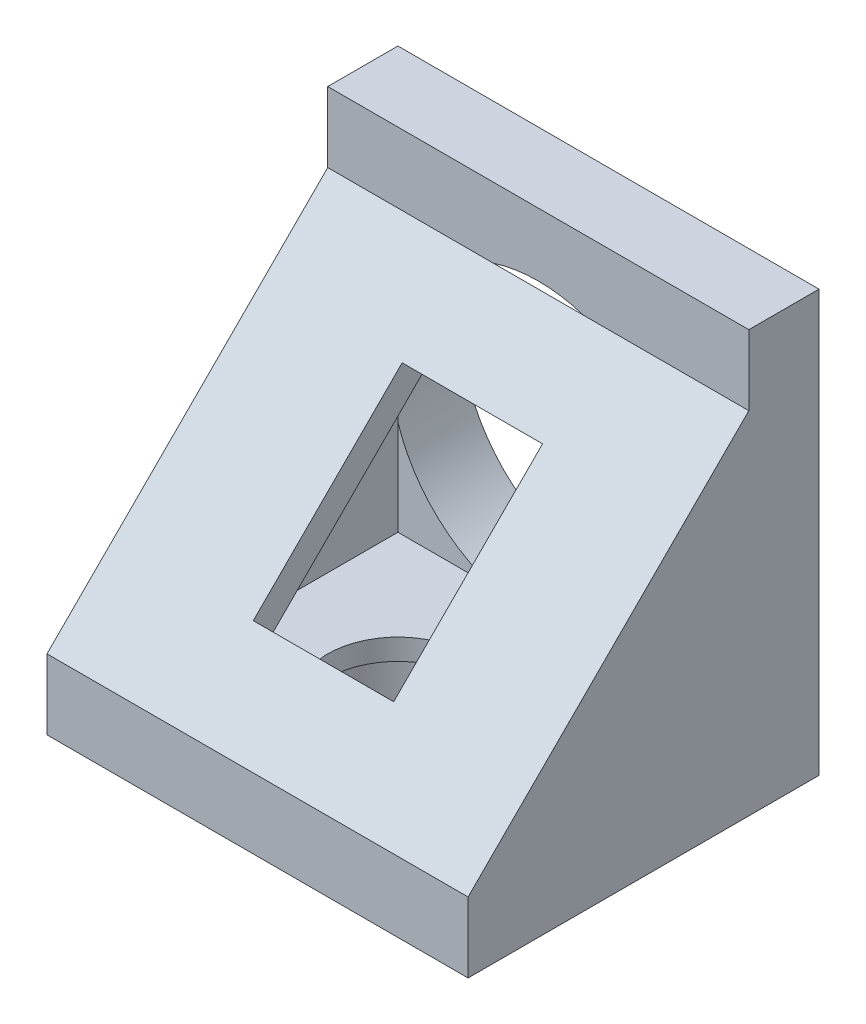
ISO-10303-21;
HEADER;
FILE_DESCRIPTION(('STEP AP214'),'2;1');
FILE_NAME('part.step','',(''),(''),'','','');
FILE_SCHEMA(('AUTOMOTIVE_DESIGN { 1 0 10303 214 1 1 1 1 }'));
ENDSEC;
DATA;
#1=APPLICATION_CONTEXT('core data for automotive mechanical design processes');
#2=APPLICATION_PROTOCOL_DEFINITION('international standard','automotive_design',2000,#1);
#3=PRODUCT_CONTEXT('',#1,'mechanical');
#4=PRODUCT('Part','Part','',(#3));
#5=PRODUCT_RELATED_PRODUCT_CATEGORY('part','',(#4));
#6=PRODUCT_DEFINITION_FORMATION('','',#4);
#7=PRODUCT_DEFINITION_CONTEXT('part definition',#1,'design');
#8=PRODUCT_DEFINITION('design','',#6,#7);
#9=PRODUCT_DEFINITION_SHAPE('','',#8);
#10=(LENGTH_UNIT() NAMED_UNIT(*) SI_UNIT(.MILLI.,.METRE.));
#11=(NAMED_UNIT(*) PLANE_ANGLE_UNIT() SI_UNIT($,.RADIAN.));
#12=(NAMED_UNIT(*) SI_UNIT($,.STERADIAN.) SOLID_ANGLE_UNIT());
#13=UNCERTAINTY_MEASURE_WITH_UNIT(LENGTH_MEASURE(1.E-05),#10,'distance_accuracy_value','');
#14=(GEOMETRIC_REPRESENTATION_CONTEXT(3) GLOBAL_UNCERTAINTY_ASSIGNED_CONTEXT((#13)) GLOBAL_UNIT_ASSIGNED_CONTEXT((#10,
#11,#12)) REPRESENTATION_CONTEXT('',''));
#15=CARTESIAN_POINT('',(0.,0.,0.));
#16=DIRECTION('',(0.,0.,1.));
#17=DIRECTION('',(1.,0.,0.));
#18=AXIS2_PLACEMENT_3D('',#15,#16,#17);
#19=CARTESIAN_POINT('',(0.,-10.,15.));
#20=DIRECTION('',(0.,-1.,0.));
#21=DIRECTION('',(0.,0.,-1.));
#22=AXIS2_PLACEMENT_3D('',#19,#20,#21);
#23=CYLINDRICAL_SURFACE('',#22,5.);
#24=CARTESIAN_POINT('',(0.,-10.,15.));
#25=DIRECTION('',(0.,-1.,0.));
#26=DIRECTION('',(0.,0.,-1.));
#27=AXIS2_PLACEMENT_3D('',#24,#25,#26);
#28=CIRCLE('',#27,5.);
#29=CARTESIAN_POINT('',(0.,-10.,10.));
#30=VERTEX_POINT('',#29);
#31=EDGE_CURVE('E330',#30,#30,#28,.T.);
#32=ORIENTED_EDGE('',*,*,#31,.F.);
#33=EDGE_LOOP('',(#32));
#34=FACE_BOUND('',#33,.T.);
#35=CARTESIAN_POINT('',(0.,-11.5,15.));
#36=DIRECTION('',(0.,-1.,0.));
#37=DIRECTION('',(0.,0.,-1.));
#38=AXIS2_PLACEMENT_3D('',#35,#36,#37);
#39=CIRCLE('',#38,5.);
#40=CARTESIAN_POINT('',(0.,-11.5,10.));
#41=VERTEX_POINT('',#40);
#42=EDGE_CURVE('E568',#41,#41,#39,.F.);
#43=ORIENTED_EDGE('',*,*,#42,.F.);
#44=EDGE_LOOP('',(#43));
#45=FACE_BOUND('',#44,.T.);
#46=ADVANCED_FACE('F39',(#34,#45),#23,.F.);
#47=CARTESIAN_POINT('',(0.,0.,5.));
#48=DIRECTION('',(0.,0.,-1.));
#49=DIRECTION('',(-1.,0.,0.));
#50=AXIS2_PLACEMENT_3D('',#47,#48,#49);
#51=PLANE('',#50);
#52=DIRECTION('',(0.,-1.,0.));
#53=VECTOR('',#52,1.);
#54=CARTESIAN_POINT('',(-10.,-10.,5.));
#55=LINE('',#54,#53);
#56=CARTESIAN_POINT('',(-10.,7.17157287525381,5.));
#57=VERTEX_POINT('',#56);
#58=CARTESIAN_POINT('',(-10.,3.20156211871643,5.));
#59=VERTEX_POINT('',#58);
#60=EDGE_CURVE('E181',#57,#59,#55,.T.);
#61=ORIENTED_EDGE('',*,*,#60,.T.);
#62=CARTESIAN_POINT('',(0.,0.,5.));
#63=DIRECTION('',(0.,0.,-1.));
#64=DIRECTION('',(-1.,0.,0.));
#65=AXIS2_PLACEMENT_3D('',#62,#63,#64);
#66=CIRCLE('',#65,10.5);
#67=CARTESIAN_POINT('',(-7.66932477438032,7.17157287525381,5.));
#68=VERTEX_POINT('',#67);
#69=EDGE_CURVE('E170',#59,#68,#66,.T.);
#70=ORIENTED_EDGE('',*,*,#69,.T.);
#71=DIRECTION('',(1.,0.,0.));
#72=VECTOR('',#71,1.);
#73=CARTESIAN_POINT('',(0.,7.17157287525381,5.));
#74=LINE('',#73,#72);
#75=EDGE_CURVE('E11',#57,#68,#74,.T.);
#76=ORIENTED_EDGE('',*,*,#75,.F.);
#77=EDGE_LOOP('',(#61,#70,#76));
#78=FACE_BOUND('',#77,.T.);
#79=ADVANCED_FACE('F187',(#78),#51,.F.);
#80=CARTESIAN_POINT('',(7.66932477438032,7.17157287525381,5.));
#81=VERTEX_POINT('',#80);
#82=CARTESIAN_POINT('',(10.,7.17157287525381,5.));
#83=VERTEX_POINT('',#82);
#84=EDGE_CURVE('E47',#81,#83,#74,.T.);
#85=ORIENTED_EDGE('',*,*,#84,.F.);
#86=CARTESIAN_POINT('',(10.,3.20156211871643,5.));
#87=VERTEX_POINT('',#86);
#88=EDGE_CURVE('E326',#81,#87,#66,.T.);
#89=ORIENTED_EDGE('',*,*,#88,.T.);
#90=DIRECTION('',(0.,1.,0.));
#91=VECTOR('',#90,1.);
#92=CARTESIAN_POINT('',(10.,-10.,5.));
#93=LINE('',#92,#91);
#94=EDGE_CURVE('E199',#87,#83,#93,.T.);
#95=ORIENTED_EDGE('',*,*,#94,.T.);
#96=EDGE_LOOP('',(#85,#89,#95));
#97=FACE_BOUND('',#96,.T.);
#98=ADVANCED_FACE('F374',(#97),#51,.F.);
#99=CARTESIAN_POINT('',(10.,-10.,5.));
#100=VERTEX_POINT('',#99);
#101=CARTESIAN_POINT('',(10.,-3.20156211871643,5.));
#102=VERTEX_POINT('',#101);
#103=EDGE_CURVE('E191',#100,#102,#93,.T.);
#104=ORIENTED_EDGE('',*,*,#103,.T.);
#105=CARTESIAN_POINT('',(3.20156211871643,-10.,5.));
#106=VERTEX_POINT('',#105);
#107=EDGE_CURVE('E629',#102,#106,#66,.T.);
#108=ORIENTED_EDGE('',*,*,#107,.T.);
#109=DIRECTION('',(1.,0.,0.));
#110=VECTOR('',#109,1.);
#111=CARTESIAN_POINT('',(-10.,-10.,5.));
#112=LINE('',#111,#110);
#113=EDGE_CURVE('E188',#106,#100,#112,.T.);
#114=ORIENTED_EDGE('',*,*,#113,.T.);
#115=EDGE_LOOP('',(#104,#108,#114));
#116=FACE_BOUND('',#115,.T.);
#117=ADVANCED_FACE('F430',(#116),#51,.F.);
#118=CARTESIAN_POINT('',(15.,15.,25.));
#119=DIRECTION('',(0.,-1.,0.));
#120=DIRECTION('',(0.,0.,-1.));
#121=AXIS2_PLACEMENT_3D('',#118,#119,#120);
#122=PLANE('',#121);
#123=DIRECTION('',(0.,0.,-1.));
#124=VECTOR('',#123,1.);
#125=CARTESIAN_POINT('',(-15.,15.,25.));
#126=LINE('',#125,#124);
#127=CARTESIAN_POINT('',(-15.,15.,5.));
#128=VERTEX_POINT('',#127);
#129=CARTESIAN_POINT('',(-15.,15.,0.));
#130=VERTEX_POINT('',#129);
#131=EDGE_CURVE('E230',#128,#130,#126,.T.);
#132=ORIENTED_EDGE('',*,*,#131,.F.);
#133=DIRECTION('',(1.,0.,0.));
#134=VECTOR('',#133,1.);
#135=CARTESIAN_POINT('',(-28.,15.,5.));
#136=LINE('',#135,#134);
#137=CARTESIAN_POINT('',(15.,15.,5.));
#138=VERTEX_POINT('',#137);
#139=EDGE_CURVE('E281',#128,#138,#136,.T.);
#140=ORIENTED_EDGE('',*,*,#139,.T.);
#141=DIRECTION('',(0.,0.,-1.));
#142=VECTOR('',#141,1.);
#143=CARTESIAN_POINT('',(15.,15.,25.));
#144=LINE('',#143,#142);
#145=CARTESIAN_POINT('',(15.,15.,0.));
#146=VERTEX_POINT('',#145);
#147=EDGE_CURVE('E215',#138,#146,#144,.T.);
#148=ORIENTED_EDGE('',*,*,#147,.T.);
#149=DIRECTION('',(-1.,0.,0.));
#150=VECTOR('',#149,1.);
#151=CARTESIAN_POINT('',(15.,15.,0.));
#152=LINE('',#151,#150);
#153=EDGE_CURVE('E204',#146,#130,#152,.T.);
#154=ORIENTED_EDGE('',*,*,#153,.T.);
#155=EDGE_LOOP('',(#132,#140,#148,#154));
#156=FACE_BOUND('',#155,.T.);
#157=ADVANCED_FACE('F41',(#156),#122,.F.);
#158=CARTESIAN_POINT('',(-15.,-15.,25.));
#159=DIRECTION('',(1.,0.,0.));
#160=DIRECTION('',(0.,0.,-1.));
#161=AXIS2_PLACEMENT_3D('',#158,#159,#160);
#162=PLANE('',#161);
#163=DIRECTION('',(0.,0.707106781186548,-0.707106781186548));
#164=VECTOR('',#163,1.);
#165=CARTESIAN_POINT('',(-15.,-12.5,27.5));
#166=LINE('',#165,#164);
#167=CARTESIAN_POINT('',(-15.,-10.,25.));
#168=VERTEX_POINT('',#167);
#169=CARTESIAN_POINT('',(-15.,10.,5.));
#170=VERTEX_POINT('',#169);
#171=EDGE_CURVE('E284',#168,#170,#166,.T.);
#172=ORIENTED_EDGE('',*,*,#171,.T.);
#173=DIRECTION('',(0.,1.,0.));
#174=VECTOR('',#173,1.);
#175=CARTESIAN_POINT('',(-15.,-15.,5.));
#176=LINE('',#175,#174);
#177=EDGE_CURVE('E200',#170,#128,#176,.T.);
#178=ORIENTED_EDGE('',*,*,#177,.T.);
#179=ORIENTED_EDGE('',*,*,#131,.T.);
#180=DIRECTION('',(0.,-1.,0.));
#181=VECTOR('',#180,1.);
#182=CARTESIAN_POINT('',(-15.,-15.,0.));
#183=LINE('',#182,#181);
#184=CARTESIAN_POINT('',(-15.,-15.,0.));
#185=VERTEX_POINT('',#184);
#186=EDGE_CURVE('E218',#130,#185,#183,.T.);
#187=ORIENTED_EDGE('',*,*,#186,.T.);
#188=DIRECTION('',(0.,0.,-1.));
#189=VECTOR('',#188,1.);
#190=CARTESIAN_POINT('',(-15.,-15.,25.));
#191=LINE('',#190,#189);
#192=CARTESIAN_POINT('',(-15.,-15.,25.));
#193=VERTEX_POINT('',#192);
#194=EDGE_CURVE('E228',#193,#185,#191,.T.);
#195=ORIENTED_EDGE('',*,*,#194,.F.);
#196=DIRECTION('',(0.,-1.,0.));
#197=VECTOR('',#196,1.);
#198=CARTESIAN_POINT('',(-15.,-15.,25.));
#199=LINE('',#198,#197);
#200=EDGE_CURVE('E207',#168,#193,#199,.T.);
#201=ORIENTED_EDGE('',*,*,#200,.F.);
#202=EDGE_LOOP('',(#172,#178,#179,#187,#195,#201));
#203=FACE_BOUND('',#202,.T.);
#204=ADVANCED_FACE('F290',(#203),#162,.F.);
#205=CARTESIAN_POINT('',(15.,-15.,25.));
#206=DIRECTION('',(0.,1.,0.));
#207=DIRECTION('',(0.,0.,1.));
#208=AXIS2_PLACEMENT_3D('',#205,#206,#207);
#209=PLANE('',#208);
#210=CARTESIAN_POINT('',(0.,-15.,15.));
#211=DIRECTION('',(0.,-1.,0.));
#212=DIRECTION('',(0.,0.,-1.));
#213=AXIS2_PLACEMENT_3D('',#210,#211,#212);
#214=CIRCLE('',#213,6.5);
#215=CARTESIAN_POINT('',(0.,-15.,8.5));
#216=VERTEX_POINT('',#215);
#217=EDGE_CURVE('E574',#216,#216,#214,.T.);
#218=ORIENTED_EDGE('',*,*,#217,.F.);
#219=EDGE_LOOP('',(#218));
#220=FACE_BOUND('',#219,.T.);
#221=DIRECTION('',(1.,0.,0.));
#222=VECTOR('',#221,1.);
#223=CARTESIAN_POINT('',(15.,-15.,0.));
#224=LINE('',#223,#222);
#225=CARTESIAN_POINT('',(15.,-15.,0.));
#226=VERTEX_POINT('',#225);
#227=EDGE_CURVE('E220',#185,#226,#224,.T.);
#228=ORIENTED_EDGE('',*,*,#227,.T.);
#229=DIRECTION('',(0.,0.,-1.));
#230=VECTOR('',#229,1.);
#231=CARTESIAN_POINT('',(15.,-15.,25.));
#232=LINE('',#231,#230);
#233=CARTESIAN_POINT('',(15.,-15.,25.));
#234=VERTEX_POINT('',#233);
#235=EDGE_CURVE('E225',#234,#226,#232,.T.);
#236=ORIENTED_EDGE('',*,*,#235,.F.);
#237=DIRECTION('',(1.,0.,0.));
#238=VECTOR('',#237,1.);
#239=CARTESIAN_POINT('',(15.,-15.,25.));
#240=LINE('',#239,#238);
#241=EDGE_CURVE('E209',#193,#234,#240,.T.);
#242=ORIENTED_EDGE('',*,*,#241,.F.);
#243=ORIENTED_EDGE('',*,*,#194,.T.);
#244=EDGE_LOOP('',(#228,#236,#242,#243));
#245=FACE_BOUND('',#244,.T.);
#246=ADVANCED_FACE('F305',(#220,#245),#209,.F.);
#247=CARTESIAN_POINT('',(15.,-15.,25.));
#248=DIRECTION('',(-1.,0.,0.));
#249=DIRECTION('',(0.,0.,1.));
#250=AXIS2_PLACEMENT_3D('',#247,#248,#249);
#251=PLANE('',#250);
#252=DIRECTION('',(0.,0.707106781186548,-0.707106781186548));
#253=VECTOR('',#252,1.);
#254=CARTESIAN_POINT('',(15.,7.5,7.5));
#255=LINE('',#254,#253);
#256=CARTESIAN_POINT('',(15.,-10.,25.));
#257=VERTEX_POINT('',#256);
#258=CARTESIAN_POINT('',(15.,10.,5.));
#259=VERTEX_POINT('',#258);
#260=EDGE_CURVE('E275',#257,#259,#255,.T.);
#261=ORIENTED_EDGE('',*,*,#260,.F.);
#262=DIRECTION('',(0.,1.,0.));
#263=VECTOR('',#262,1.);
#264=CARTESIAN_POINT('',(15.,-15.,25.));
#265=LINE('',#264,#263);
#266=EDGE_CURVE('E212',#234,#257,#265,.T.);
#267=ORIENTED_EDGE('',*,*,#266,.F.);
#268=ORIENTED_EDGE('',*,*,#235,.T.);
#269=DIRECTION('',(0.,1.,0.));
#270=VECTOR('',#269,1.);
#271=CARTESIAN_POINT('',(15.,-15.,0.));
#272=LINE('',#271,#270);
#273=EDGE_CURVE('E210',#226,#146,#272,.T.);
#274=ORIENTED_EDGE('',*,*,#273,.T.);
#275=ORIENTED_EDGE('',*,*,#147,.F.);
#276=DIRECTION('',(0.,1.,0.));
#277=VECTOR('',#276,1.);
#278=CARTESIAN_POINT('',(15.,0.,5.));
#279=LINE('',#278,#277);
#280=EDGE_CURVE('E278',#259,#138,#279,.T.);
#281=ORIENTED_EDGE('',*,*,#280,.F.);
#282=EDGE_LOOP('',(#261,#267,#268,#274,#275,#281));
#283=FACE_BOUND('',#282,.T.);
#284=ADVANCED_FACE('F580',(#283),#251,.F.);
#285=CARTESIAN_POINT('',(0.,0.,25.));
#286=DIRECTION('',(0.,0.,-1.));
#287=DIRECTION('',(-1.,0.,0.));
#288=AXIS2_PLACEMENT_3D('',#285,#286,#287);
#289=PLANE('',#288);
#290=ORIENTED_EDGE('',*,*,#266,.T.);
#291=DIRECTION('',(1.,0.,0.));
#292=VECTOR('',#291,1.);
#293=CARTESIAN_POINT('',(-10.,-10.,25.));
#294=LINE('',#293,#292);
#295=EDGE_CURVE('E197',#168,#257,#294,.T.);
#296=ORIENTED_EDGE('',*,*,#295,.F.);
#297=ORIENTED_EDGE('',*,*,#200,.T.);
#298=ORIENTED_EDGE('',*,*,#241,.T.);
#299=EDGE_LOOP('',(#290,#296,#297,#298));
#300=FACE_BOUND('',#299,.T.);
#301=ADVANCED_FACE('F309',(#300),#289,.F.);
#302=CARTESIAN_POINT('',(0.,0.,0.));
#303=DIRECTION('',(0.,0.,-1.));
#304=DIRECTION('',(-1.,0.,0.));
#305=AXIS2_PLACEMENT_3D('',#302,#303,#304);
#306=PLANE('',#305);
#307=CARTESIAN_POINT('',(0.,0.,0.));
#308=DIRECTION('',(0.,0.,-1.));
#309=DIRECTION('',(-1.,0.,0.));
#310=AXIS2_PLACEMENT_3D('',#307,#308,#309);
#311=CIRCLE('',#310,10.5);
#312=CARTESIAN_POINT('',(-10.5,0.,0.));
#313=VERTEX_POINT('',#312);
#314=EDGE_CURVE('E168',#313,#313,#311,.T.);
#315=ORIENTED_EDGE('',*,*,#314,.F.);
#316=EDGE_LOOP('',(#315));
#317=FACE_BOUND('',#316,.T.);
#318=ORIENTED_EDGE('',*,*,#153,.F.);
#319=ORIENTED_EDGE('',*,*,#273,.F.);
#320=ORIENTED_EDGE('',*,*,#227,.F.);
#321=ORIENTED_EDGE('',*,*,#186,.F.);
#322=EDGE_LOOP('',(#318,#319,#320,#321));
#323=FACE_BOUND('',#322,.T.);
#324=ADVANCED_FACE('F300',(#317,#323),#306,.T.);
#325=DIRECTION('',(1.,0.,0.));
#326=VECTOR('',#325,1.);
#327=CARTESIAN_POINT('',(-28.,10.,5.));
#328=LINE('',#327,#326);
#329=CARTESIAN_POINT('',(-3.20156211871644,10.,5.));
#330=VERTEX_POINT('',#329);
#331=EDGE_CURVE('E285',#170,#330,#328,.T.);
#332=ORIENTED_EDGE('',*,*,#331,.T.);
#333=CARTESIAN_POINT('',(3.20156211871644,9.99999999999999,5.));
#334=VERTEX_POINT('',#333);
#335=EDGE_CURVE('E318',#330,#334,#66,.T.);
#336=ORIENTED_EDGE('',*,*,#335,.T.);
#337=EDGE_CURVE('E280',#334,#259,#328,.T.);
#338=ORIENTED_EDGE('',*,*,#337,.T.);
#339=ORIENTED_EDGE('',*,*,#280,.T.);
#340=ORIENTED_EDGE('',*,*,#139,.F.);
#341=ORIENTED_EDGE('',*,*,#177,.F.);
#342=EDGE_LOOP('',(#332,#336,#338,#339,#340,#341));
#343=FACE_BOUND('',#342,.T.);
#344=ADVANCED_FACE('F317',(#343),#51,.F.);
#345=CARTESIAN_POINT('',(-28.,7.5,7.5));
#346=DIRECTION('',(0.,-0.707106781186548,-0.707106781186548));
#347=DIRECTION('',(0.,0.707106781186548,-0.707106781186548));
#348=AXIS2_PLACEMENT_3D('',#345,#346,#347);
#349=PLANE('',#348);
#350=ORIENTED_EDGE('',*,*,#171,.F.);
#351=ORIENTED_EDGE('',*,*,#295,.T.);
#352=ORIENTED_EDGE('',*,*,#260,.T.);
#353=ORIENTED_EDGE('',*,*,#337,.F.);
#354=EDGE_CURVE('E288',#330,#334,#328,.T.);
#355=ORIENTED_EDGE('',*,*,#354,.F.);
#356=ORIENTED_EDGE('',*,*,#331,.F.);
#357=EDGE_LOOP('',(#350,#351,#352,#353,#355,#356));
#358=FACE_BOUND('',#357,.T.);
#359=DIRECTION('',(0.,-0.707106781186547,0.707106781186547));
#360=VECTOR('',#359,1.);
#361=CARTESIAN_POINT('',(-5.,5.3033008588991,9.6966991411009));
#362=LINE('',#361,#360);
#363=CARTESIAN_POINT('',(-5.,5.3033008588991,9.6966991411009));
#364=VERTEX_POINT('',#363);
#365=CARTESIAN_POINT('',(-5.,-5.3033008588991,20.3033008588991));
#366=VERTEX_POINT('',#365);
#367=EDGE_CURVE('E241',#364,#366,#362,.T.);
#368=ORIENTED_EDGE('',*,*,#367,.F.);
#369=DIRECTION('',(-1.,0.,0.));
#370=VECTOR('',#369,1.);
#371=CARTESIAN_POINT('',(5.,5.3033008588991,9.6966991411009));
#372=LINE('',#371,#370);
#373=CARTESIAN_POINT('',(5.,5.3033008588991,9.6966991411009));
#374=VERTEX_POINT('',#373);
#375=EDGE_CURVE('E256',#374,#364,#372,.T.);
#376=ORIENTED_EDGE('',*,*,#375,.F.);
#377=DIRECTION('',(0.,0.707106781186547,-0.707106781186547));
#378=VECTOR('',#377,1.);
#379=CARTESIAN_POINT('',(5.,5.3033008588991,9.6966991411009));
#380=LINE('',#379,#378);
#381=CARTESIAN_POINT('',(5.,-5.3033008588991,20.3033008588991));
#382=VERTEX_POINT('',#381);
#383=EDGE_CURVE('E248',#382,#374,#380,.T.);
#384=ORIENTED_EDGE('',*,*,#383,.F.);
#385=DIRECTION('',(1.,0.,0.));
#386=VECTOR('',#385,1.);
#387=CARTESIAN_POINT('',(5.,-5.3033008588991,20.3033008588991));
#388=LINE('',#387,#386);
#389=EDGE_CURVE('E242',#366,#382,#388,.T.);
#390=ORIENTED_EDGE('',*,*,#389,.F.);
#391=EDGE_LOOP('',(#368,#376,#384,#390));
#392=FACE_BOUND('',#391,.T.);
#393=ADVANCED_FACE('F312',(#358,#392),#349,.F.);
#394=CARTESIAN_POINT('',(0.,6.08578643762691,6.0857864376269));
#395=DIRECTION('',(0.,0.707106781186548,0.707106781186547));
#396=DIRECTION('',(0.,-0.707106781186547,0.707106781186548));
#397=AXIS2_PLACEMENT_3D('',#394,#395,#396);
#398=PLANE('',#397);
#399=DIRECTION('',(-1.,0.,0.));
#400=VECTOR('',#399,1.);
#401=CARTESIAN_POINT('',(5.,3.88908729652601,8.2824855787278));
#402=LINE('',#401,#400);
#403=CARTESIAN_POINT('',(5.,3.88908729652601,8.2824855787278));
#404=VERTEX_POINT('',#403);
#405=CARTESIAN_POINT('',(-5.,3.88908729652601,8.2824855787278));
#406=VERTEX_POINT('',#405);
#407=EDGE_CURVE('E251',#404,#406,#402,.T.);
#408=ORIENTED_EDGE('',*,*,#407,.T.);
#409=DIRECTION('',(0.,-0.707106781186547,0.707106781186547));
#410=VECTOR('',#409,1.);
#411=CARTESIAN_POINT('',(-5.,3.88908729652601,8.2824855787278));
#412=LINE('',#411,#410);
#413=CARTESIAN_POINT('',(-5.,-6.7175144212722,18.889087296526));
#414=VERTEX_POINT('',#413);
#415=EDGE_CURVE('E259',#406,#414,#412,.T.);
#416=ORIENTED_EDGE('',*,*,#415,.T.);
#417=DIRECTION('',(1.,0.,0.));
#418=VECTOR('',#417,1.);
#419=CARTESIAN_POINT('',(5.,-6.7175144212722,18.889087296526));
#420=LINE('',#419,#418);
#421=CARTESIAN_POINT('',(5.,-6.7175144212722,18.889087296526));
#422=VERTEX_POINT('',#421);
#423=EDGE_CURVE('E336',#414,#422,#420,.T.);
#424=ORIENTED_EDGE('',*,*,#423,.T.);
#425=DIRECTION('',(0.,0.707106781186547,-0.707106781186547));
#426=VECTOR('',#425,1.);
#427=CARTESIAN_POINT('',(5.,3.88908729652601,8.2824855787278));
#428=LINE('',#427,#426);
#429=EDGE_CURVE('E338',#422,#404,#428,.T.);
#430=ORIENTED_EDGE('',*,*,#429,.T.);
#431=EDGE_LOOP('',(#408,#416,#424,#430));
#432=FACE_BOUND('',#431,.T.);
#433=ORIENTED_EDGE('',*,*,#75,.T.);
#434=EDGE_CURVE('E48',#68,#81,#74,.T.);
#435=ORIENTED_EDGE('',*,*,#434,.T.);
#436=ORIENTED_EDGE('',*,*,#84,.T.);
#437=DIRECTION('',(0.,-0.707106781186547,0.707106781186548));
#438=VECTOR('',#437,1.);
#439=CARTESIAN_POINT('',(10.,-1.41421356237309,13.5857864376269));
#440=LINE('',#439,#438);
#441=CARTESIAN_POINT('',(10.,-10.,22.1715728752538));
#442=VERTEX_POINT('',#441);
#443=EDGE_CURVE('E273',#83,#442,#440,.T.);
#444=ORIENTED_EDGE('',*,*,#443,.T.);
#445=DIRECTION('',(-1.,0.,0.));
#446=VECTOR('',#445,1.);
#447=CARTESIAN_POINT('',(-10.,-10.,22.1715728752538));
#448=LINE('',#447,#446);
#449=CARTESIAN_POINT('',(-10.,-10.,22.1715728752538));
#450=VERTEX_POINT('',#449);
#451=EDGE_CURVE('E270',#442,#450,#448,.T.);
#452=ORIENTED_EDGE('',*,*,#451,.T.);
#453=DIRECTION('',(0.,0.707106781186547,-0.707106781186548));
#454=VECTOR('',#453,1.);
#455=CARTESIAN_POINT('',(-10.,-1.41421356237309,13.5857864376269));
#456=LINE('',#455,#454);
#457=EDGE_CURVE('E262',#450,#57,#456,.T.);
#458=ORIENTED_EDGE('',*,*,#457,.T.);
#459=EDGE_LOOP('',(#433,#435,#436,#444,#452,#458));
#460=FACE_BOUND('',#459,.T.);
#461=ADVANCED_FACE('F343',(#432,#460),#398,.F.);
#462=CARTESIAN_POINT('',(-5.,3.88908729652601,8.2824855787278));
#463=DIRECTION('',(-1.,0.,0.));
#464=DIRECTION('',(0.,0.,1.));
#465=AXIS2_PLACEMENT_3D('',#462,#463,#464);
#466=PLANE('',#465);
#467=ORIENTED_EDGE('',*,*,#367,.T.);
#468=DIRECTION('',(0.,0.707106781186548,0.707106781186547));
#469=VECTOR('',#468,1.);
#470=CARTESIAN_POINT('',(-5.,-6.7175144212722,18.889087296526));
#471=LINE('',#470,#469);
#472=EDGE_CURVE('E267',#414,#366,#471,.T.);
#473=ORIENTED_EDGE('',*,*,#472,.F.);
#474=ORIENTED_EDGE('',*,*,#415,.F.);
#475=DIRECTION('',(0.,0.707106781186548,0.707106781186547));
#476=VECTOR('',#475,1.);
#477=CARTESIAN_POINT('',(-5.,3.88908729652601,8.2824855787278));
#478=LINE('',#477,#476);
#479=EDGE_CURVE('E260',#406,#364,#478,.T.);
#480=ORIENTED_EDGE('',*,*,#479,.T.);
#481=EDGE_LOOP('',(#467,#473,#474,#480));
#482=FACE_BOUND('',#481,.T.);
#483=ADVANCED_FACE('F348',(#482),#466,.F.);
#484=CARTESIAN_POINT('',(5.,3.88908729652601,8.2824855787278));
#485=DIRECTION('',(0.,0.707106781186547,-0.707106781186548));
#486=DIRECTION('',(0.,0.707106781186548,0.707106781186547));
#487=AXIS2_PLACEMENT_3D('',#484,#485,#486);
#488=PLANE('',#487);
#489=ORIENTED_EDGE('',*,*,#375,.T.);
#490=ORIENTED_EDGE('',*,*,#479,.F.);
#491=ORIENTED_EDGE('',*,*,#407,.F.);
#492=DIRECTION('',(0.,0.707106781186548,0.707106781186547));
#493=VECTOR('',#492,1.);
#494=CARTESIAN_POINT('',(5.,3.88908729652601,8.2824855787278));
#495=LINE('',#494,#493);
#496=EDGE_CURVE('E263',#404,#374,#495,.T.);
#497=ORIENTED_EDGE('',*,*,#496,.T.);
#498=EDGE_LOOP('',(#489,#490,#491,#497));
#499=FACE_BOUND('',#498,.T.);
#500=ADVANCED_FACE('F346',(#499),#488,.F.);
#501=CARTESIAN_POINT('',(5.,3.88908729652601,8.2824855787278));
#502=DIRECTION('',(1.,0.,0.));
#503=DIRECTION('',(0.,0.,-1.));
#504=AXIS2_PLACEMENT_3D('',#501,#502,#503);
#505=PLANE('',#504);
#506=ORIENTED_EDGE('',*,*,#383,.T.);
#507=ORIENTED_EDGE('',*,*,#496,.F.);
#508=ORIENTED_EDGE('',*,*,#429,.F.);
#509=DIRECTION('',(0.,0.707106781186548,0.707106781186547));
#510=VECTOR('',#509,1.);
#511=CARTESIAN_POINT('',(5.,-6.7175144212722,18.889087296526));
#512=LINE('',#511,#510);
#513=EDGE_CURVE('E265',#422,#382,#512,.T.);
#514=ORIENTED_EDGE('',*,*,#513,.T.);
#515=EDGE_LOOP('',(#506,#507,#508,#514));
#516=FACE_BOUND('',#515,.T.);
#517=ADVANCED_FACE('F356',(#516),#505,.F.);
#518=CARTESIAN_POINT('',(5.,-6.7175144212722,18.889087296526));
#519=DIRECTION('',(0.,-0.707106781186547,0.707106781186548));
#520=DIRECTION('',(0.,-0.707106781186548,-0.707106781186547));
#521=AXIS2_PLACEMENT_3D('',#518,#519,#520);
#522=PLANE('',#521);
#523=ORIENTED_EDGE('',*,*,#389,.T.);
#524=ORIENTED_EDGE('',*,*,#513,.F.);
#525=ORIENTED_EDGE('',*,*,#423,.F.);
#526=ORIENTED_EDGE('',*,*,#472,.T.);
#527=EDGE_LOOP('',(#523,#524,#525,#526));
#528=FACE_BOUND('',#527,.T.);
#529=ADVANCED_FACE('F353',(#528),#522,.F.);
#530=CARTESIAN_POINT('',(-10.,-10.,5.));
#531=VERTEX_POINT('',#530);
#532=CARTESIAN_POINT('',(-3.20156211871643,-10.,5.));
#533=VERTEX_POINT('',#532);
#534=EDGE_CURVE('E189',#531,#533,#112,.T.);
#535=ORIENTED_EDGE('',*,*,#534,.T.);
#536=CARTESIAN_POINT('',(-10.,-3.20156211871643,5.));
#537=VERTEX_POINT('',#536);
#538=EDGE_CURVE('E167',#533,#537,#66,.T.);
#539=ORIENTED_EDGE('',*,*,#538,.T.);
#540=EDGE_CURVE('E184',#537,#531,#55,.T.);
#541=ORIENTED_EDGE('',*,*,#540,.T.);
#542=EDGE_LOOP('',(#535,#539,#541));
#543=FACE_BOUND('',#542,.T.);
#544=ADVANCED_FACE('F365',(#543),#51,.F.);
#545=CARTESIAN_POINT('',(-10.,-10.,5.));
#546=DIRECTION('',(-1.,0.,0.));
#547=DIRECTION('',(0.,0.,1.));
#548=AXIS2_PLACEMENT_3D('',#545,#546,#547);
#549=PLANE('',#548);
#550=ORIENTED_EDGE('',*,*,#457,.F.);
#551=DIRECTION('',(0.,0.,1.));
#552=VECTOR('',#551,1.);
#553=CARTESIAN_POINT('',(-10.,-10.,5.));
#554=LINE('',#553,#552);
#555=EDGE_CURVE('E196',#531,#450,#554,.T.);
#556=ORIENTED_EDGE('',*,*,#555,.F.);
#557=ORIENTED_EDGE('',*,*,#540,.F.);
#558=EDGE_CURVE('E165',#59,#537,#55,.T.);
#559=ORIENTED_EDGE('',*,*,#558,.F.);
#560=ORIENTED_EDGE('',*,*,#60,.F.);
#561=EDGE_LOOP('',(#550,#556,#557,#559,#560));
#562=FACE_BOUND('',#561,.T.);
#563=ADVANCED_FACE('F180',(#562),#549,.F.);
#564=CARTESIAN_POINT('',(-10.,-10.,5.));
#565=DIRECTION('',(0.,-1.,0.));
#566=DIRECTION('',(0.,0.,-1.));
#567=AXIS2_PLACEMENT_3D('',#564,#565,#566);
#568=PLANE('',#567);
#569=ORIENTED_EDGE('',*,*,#31,.T.);
#570=EDGE_LOOP('',(#569));
#571=FACE_BOUND('',#570,.T.);
#572=ORIENTED_EDGE('',*,*,#451,.F.);
#573=DIRECTION('',(0.,0.,1.));
#574=VECTOR('',#573,1.);
#575=CARTESIAN_POINT('',(10.,-10.,5.));
#576=LINE('',#575,#574);
#577=EDGE_CURVE('E201',#100,#442,#576,.T.);
#578=ORIENTED_EDGE('',*,*,#577,.F.);
#579=ORIENTED_EDGE('',*,*,#113,.F.);
#580=EDGE_CURVE('E185',#533,#106,#112,.T.);
#581=ORIENTED_EDGE('',*,*,#580,.F.);
#582=ORIENTED_EDGE('',*,*,#534,.F.);
#583=ORIENTED_EDGE('',*,*,#555,.T.);
#584=EDGE_LOOP('',(#572,#578,#579,#581,#582,#583));
#585=FACE_BOUND('',#584,.T.);
#586=ADVANCED_FACE('F483',(#571,#585),#568,.F.);
#587=CARTESIAN_POINT('',(10.,-10.,5.));
#588=DIRECTION('',(1.,0.,0.));
#589=DIRECTION('',(0.,0.,-1.));
#590=AXIS2_PLACEMENT_3D('',#587,#588,#589);
#591=PLANE('',#590);
#592=ORIENTED_EDGE('',*,*,#443,.F.);
#593=ORIENTED_EDGE('',*,*,#94,.F.);
#594=EDGE_CURVE('E176',#102,#87,#93,.T.);
#595=ORIENTED_EDGE('',*,*,#594,.F.);
#596=ORIENTED_EDGE('',*,*,#103,.F.);
#597=ORIENTED_EDGE('',*,*,#577,.T.);
#598=EDGE_LOOP('',(#592,#593,#595,#596,#597));
#599=FACE_BOUND('',#598,.T.);
#600=ADVANCED_FACE('F384',(#599),#591,.F.);
#601=CARTESIAN_POINT('',(0.,0.,5.));
#602=DIRECTION('',(0.,0.,-1.));
#603=DIRECTION('',(-1.,0.,0.));
#604=AXIS2_PLACEMENT_3D('',#601,#602,#603);
#605=PLANE('',#604);
#606=ORIENTED_EDGE('',*,*,#558,.T.);
#607=EDGE_CURVE('E55',#537,#59,#66,.T.);
#608=ORIENTED_EDGE('',*,*,#607,.T.);
#609=EDGE_LOOP('',(#606,#608));
#610=FACE_BOUND('',#609,.T.);
#611=ADVANCED_FACE('F163',(#610),#605,.T.);
#612=ORIENTED_EDGE('',*,*,#580,.T.);
#613=EDGE_CURVE('E628',#106,#533,#66,.T.);
#614=ORIENTED_EDGE('',*,*,#613,.T.);
#615=EDGE_LOOP('',(#612,#614));
#616=FACE_BOUND('',#615,.T.);
#617=ADVANCED_FACE('F383',(#616),#605,.T.);
#618=ORIENTED_EDGE('',*,*,#594,.T.);
#619=EDGE_CURVE('E327',#87,#102,#66,.T.);
#620=ORIENTED_EDGE('',*,*,#619,.T.);
#621=EDGE_LOOP('',(#618,#620));
#622=FACE_BOUND('',#621,.T.);
#623=ADVANCED_FACE('F520',(#622),#605,.T.);
#624=EDGE_CURVE('E63',#68,#330,#66,.T.);
#625=ORIENTED_EDGE('',*,*,#624,.T.);
#626=ORIENTED_EDGE('',*,*,#354,.T.);
#627=EDGE_CURVE('E320',#334,#81,#66,.T.);
#628=ORIENTED_EDGE('',*,*,#627,.T.);
#629=ORIENTED_EDGE('',*,*,#434,.F.);
#630=EDGE_LOOP('',(#625,#626,#628,#629));
#631=FACE_BOUND('',#630,.T.);
#632=ADVANCED_FACE('F323',(#631),#605,.T.);
#633=CARTESIAN_POINT('',(0.,0.,5.));
#634=DIRECTION('',(0.,0.,-1.));
#635=DIRECTION('',(-1.,0.,0.));
#636=AXIS2_PLACEMENT_3D('',#633,#634,#635);
#637=CYLINDRICAL_SURFACE('',#636,10.5);
#638=ORIENTED_EDGE('',*,*,#69,.F.);
#639=ORIENTED_EDGE('',*,*,#607,.F.);
#640=ORIENTED_EDGE('',*,*,#538,.F.);
#641=ORIENTED_EDGE('',*,*,#613,.F.);
#642=ORIENTED_EDGE('',*,*,#107,.F.);
#643=ORIENTED_EDGE('',*,*,#619,.F.);
#644=ORIENTED_EDGE('',*,*,#88,.F.);
#645=ORIENTED_EDGE('',*,*,#627,.F.);
#646=ORIENTED_EDGE('',*,*,#335,.F.);
#647=ORIENTED_EDGE('',*,*,#624,.F.);
#648=EDGE_LOOP('',(#638,#639,#640,#641,#642,#643,#644,#645,#646,#647));
#649=FACE_BOUND('',#648,.T.);
#650=ORIENTED_EDGE('',*,*,#314,.T.);
#651=EDGE_LOOP('',(#650));
#652=FACE_BOUND('',#651,.T.);
#653=ADVANCED_FACE('F172',(#649,#652),#637,.F.);
#654=CARTESIAN_POINT('',(0.,-11.5,15.));
#655=DIRECTION('',(0.,-1.,0.));
#656=DIRECTION('',(0.,0.,-1.));
#657=AXIS2_PLACEMENT_3D('',#654,#655,#656);
#658=CYLINDRICAL_SURFACE('',#657,6.5);
#659=CARTESIAN_POINT('',(0.,-11.5,15.));
#660=DIRECTION('',(0.,-1.,0.));
#661=DIRECTION('',(0.,0.,-1.));
#662=AXIS2_PLACEMENT_3D('',#659,#660,#661);
#663=CIRCLE('',#662,6.5);
#664=CARTESIAN_POINT('',(0.,-11.5,8.5));
#665=VERTEX_POINT('',#664);
#666=EDGE_CURVE('E571',#665,#665,#663,.T.);
#667=ORIENTED_EDGE('',*,*,#666,.F.);
#668=EDGE_LOOP('',(#667));
#669=FACE_BOUND('',#668,.T.);
#670=ORIENTED_EDGE('',*,*,#217,.T.);
#671=EDGE_LOOP('',(#670));
#672=FACE_BOUND('',#671,.T.);
#673=ADVANCED_FACE('F379',(#669,#672),#658,.F.);
#674=CARTESIAN_POINT('',(0.,-11.5,0.));
#675=DIRECTION('',(0.,-1.,0.));
#676=DIRECTION('',(0.,0.,-1.));
#677=AXIS2_PLACEMENT_3D('',#674,#675,#676);
#678=PLANE('',#677);
#679=ORIENTED_EDGE('',*,*,#42,.T.);
#680=EDGE_LOOP('',(#679));
#681=FACE_BOUND('',#680,.T.);
#682=ORIENTED_EDGE('',*,*,#666,.T.);
#683=EDGE_LOOP('',(#682));
#684=FACE_BOUND('',#683,.T.);
#685=ADVANCED_FACE('F554',(#681,#684),#678,.T.);
#686=CLOSED_SHELL('',(#46,#79,#98,#117,#157,#204,#246,#284,#301,#324,#344,#393,#461,#483,#500,
#517,#529,#544,#563,#586,#600,#611,#617,#623,#632,#653,#673,#685));
#687=MANIFOLD_SOLID_BREP('B2',#686);
#688=ADVANCED_BREP_SHAPE_REPRESENTATION('',(#18,#687),#14);
#689=SHAPE_DEFINITION_REPRESENTATION(#9,#688);
ENDSEC;
END-ISO-10303-21;
